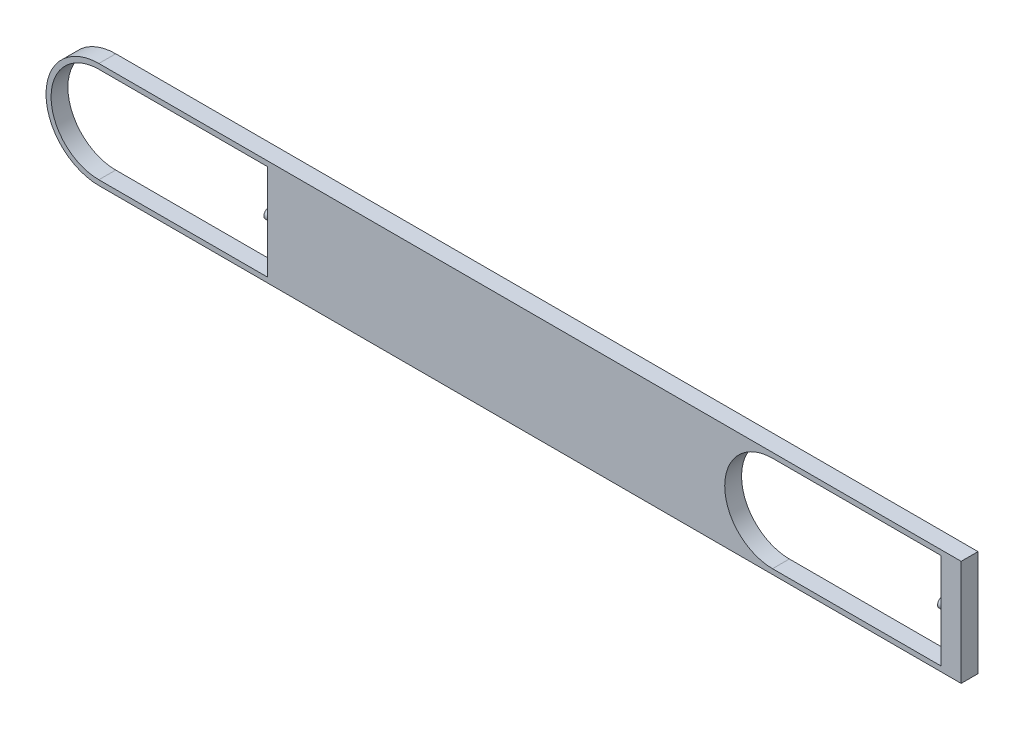
ISO-10303-21;
HEADER;
FILE_DESCRIPTION(('STEP AP214'),'2;1');
FILE_NAME('part.step','',(''),(''),'','','');
FILE_SCHEMA(('AUTOMOTIVE_DESIGN { 1 0 10303 214 1 1 1 1 }'));
ENDSEC;
DATA;
#1=APPLICATION_CONTEXT('core data for automotive mechanical design processes');
#2=APPLICATION_PROTOCOL_DEFINITION('international standard','automotive_design',2000,#1);
#3=PRODUCT_CONTEXT('',#1,'mechanical');
#4=PRODUCT('Part','Part','',(#3));
#5=PRODUCT_RELATED_PRODUCT_CATEGORY('part','',(#4));
#6=PRODUCT_DEFINITION_FORMATION('','',#4);
#7=PRODUCT_DEFINITION_CONTEXT('part definition',#1,'design');
#8=PRODUCT_DEFINITION('design','',#6,#7);
#9=PRODUCT_DEFINITION_SHAPE('','',#8);
#10=(LENGTH_UNIT() NAMED_UNIT(*) SI_UNIT(.MILLI.,.METRE.));
#11=(NAMED_UNIT(*) PLANE_ANGLE_UNIT() SI_UNIT($,.RADIAN.));
#12=(NAMED_UNIT(*) SI_UNIT($,.STERADIAN.) SOLID_ANGLE_UNIT());
#13=UNCERTAINTY_MEASURE_WITH_UNIT(LENGTH_MEASURE(1.E-05),#10,'distance_accuracy_value','');
#14=(GEOMETRIC_REPRESENTATION_CONTEXT(3) GLOBAL_UNCERTAINTY_ASSIGNED_CONTEXT((#13)) GLOBAL_UNIT_ASSIGNED_CONTEXT((#10,
#11,#12)) REPRESENTATION_CONTEXT('',''));
#15=CARTESIAN_POINT('',(0.,0.,0.));
#16=DIRECTION('',(0.,0.,1.));
#17=DIRECTION('',(1.,0.,0.));
#18=AXIS2_PLACEMENT_3D('',#15,#16,#17);
#19=CARTESIAN_POINT('',(0.,0.,6.35));
#20=DIRECTION('',(0.,0.,1.));
#21=DIRECTION('',(1.,0.,0.));
#22=AXIS2_PLACEMENT_3D('',#19,#20,#21);
#23=PLANE('',#22);
#24=DIRECTION('',(-1.,0.,0.));
#25=VECTOR('',#24,1.);
#26=CARTESIAN_POINT('',(0.,18.034,6.35));
#27=LINE('',#26,#25);
#28=CARTESIAN_POINT('',(63.5,18.034,6.35));
#29=VERTEX_POINT('',#28);
#30=CARTESIAN_POINT('',(0.,18.034,6.35));
#31=VERTEX_POINT('',#30);
#32=EDGE_CURVE('E165',#29,#31,#27,.T.);
#33=ORIENTED_EDGE('',*,*,#32,.F.);
#34=DIRECTION('',(0.,-1.,0.));
#35=VECTOR('',#34,1.);
#36=CARTESIAN_POINT('',(63.5,18.034,6.35));
#37=LINE('',#36,#35);
#38=CARTESIAN_POINT('',(63.5,-18.034,6.35));
#39=VERTEX_POINT('',#38);
#40=EDGE_CURVE('E176',#29,#39,#37,.T.);
#41=ORIENTED_EDGE('',*,*,#40,.T.);
#42=DIRECTION('',(1.,0.,0.));
#43=VECTOR('',#42,1.);
#44=CARTESIAN_POINT('',(0.,-18.034,6.35));
#45=LINE('',#44,#43);
#46=CARTESIAN_POINT('',(0.,-18.034,6.35));
#47=VERTEX_POINT('',#46);
#48=EDGE_CURVE('E163',#47,#39,#45,.T.);
#49=ORIENTED_EDGE('',*,*,#48,.F.);
#50=CARTESIAN_POINT('',(0.,0.,6.35));
#51=DIRECTION('',(0.,0.,1.));
#52=DIRECTION('',(1.,0.,0.));
#53=AXIS2_PLACEMENT_3D('',#50,#51,#52);
#54=CIRCLE('',#53,18.034);
#55=EDGE_CURVE('E152',#31,#47,#54,.T.);
#56=ORIENTED_EDGE('',*,*,#55,.F.);
#57=EDGE_LOOP('',(#33,#41,#49,#56));
#58=FACE_BOUND('',#57,.T.);
#59=DIRECTION('',(-1.,0.,0.));
#60=VECTOR('',#59,1.);
#61=CARTESIAN_POINT('',(254.,18.034,6.35));
#62=LINE('',#61,#60);
#63=CARTESIAN_POINT('',(317.5,18.034,6.35));
#64=VERTEX_POINT('',#63);
#65=CARTESIAN_POINT('',(254.,18.034,6.35));
#66=VERTEX_POINT('',#65);
#67=EDGE_CURVE('E202',#64,#66,#62,.T.);
#68=ORIENTED_EDGE('',*,*,#67,.F.);
#69=DIRECTION('',(0.,-1.,0.));
#70=VECTOR('',#69,1.);
#71=CARTESIAN_POINT('',(317.5,18.034,6.35));
#72=LINE('',#71,#70);
#73=CARTESIAN_POINT('',(317.5,-18.034,6.35));
#74=VERTEX_POINT('',#73);
#75=EDGE_CURVE('E213',#64,#74,#72,.T.);
#76=ORIENTED_EDGE('',*,*,#75,.T.);
#77=DIRECTION('',(1.,0.,0.));
#78=VECTOR('',#77,1.);
#79=CARTESIAN_POINT('',(254.,-18.034,6.35));
#80=LINE('',#79,#78);
#81=CARTESIAN_POINT('',(254.,-18.034,6.35));
#82=VERTEX_POINT('',#81);
#83=EDGE_CURVE('E199',#82,#74,#80,.T.);
#84=ORIENTED_EDGE('',*,*,#83,.F.);
#85=CARTESIAN_POINT('',(254.,0.,6.35));
#86=DIRECTION('',(0.,0.,1.));
#87=DIRECTION('',(1.,0.,0.));
#88=AXIS2_PLACEMENT_3D('',#85,#86,#87);
#89=CIRCLE('',#88,18.034);
#90=EDGE_CURVE('E188',#66,#82,#89,.T.);
#91=ORIENTED_EDGE('',*,*,#90,.F.);
#92=EDGE_LOOP('',(#68,#76,#84,#91));
#93=FACE_BOUND('',#92,.T.);
#94=DIRECTION('',(-1.,0.,0.));
#95=VECTOR('',#94,1.);
#96=CARTESIAN_POINT('',(127.,-19.939,6.34999999999999));
#97=LINE('',#96,#95);
#98=CARTESIAN_POINT('',(325.12,-19.939,6.34999999999999));
#99=VERTEX_POINT('',#98);
#100=CARTESIAN_POINT('',(0.,-19.939,6.35));
#101=VERTEX_POINT('',#100);
#102=EDGE_CURVE('E133',#99,#101,#97,.T.);
#103=ORIENTED_EDGE('',*,*,#102,.F.);
#104=DIRECTION('',(0.,-1.,0.));
#105=VECTOR('',#104,1.);
#106=CARTESIAN_POINT('',(325.12,19.939,6.35));
#107=LINE('',#106,#105);
#108=CARTESIAN_POINT('',(325.12,19.939,6.35));
#109=VERTEX_POINT('',#108);
#110=EDGE_CURVE('E120',#109,#99,#107,.T.);
#111=ORIENTED_EDGE('',*,*,#110,.F.);
#112=DIRECTION('',(-1.,0.,0.));
#113=VECTOR('',#112,1.);
#114=CARTESIAN_POINT('',(127.,19.939,6.35));
#115=LINE('',#114,#113);
#116=CARTESIAN_POINT('',(0.,19.939,6.35));
#117=VERTEX_POINT('',#116);
#118=EDGE_CURVE('E144',#109,#117,#115,.T.);
#119=ORIENTED_EDGE('',*,*,#118,.T.);
#120=CARTESIAN_POINT('',(0.,0.,6.35));
#121=DIRECTION('',(0.,0.,1.));
#122=DIRECTION('',(1.,0.,0.));
#123=AXIS2_PLACEMENT_3D('',#120,#121,#122);
#124=CIRCLE('',#123,19.939);
#125=EDGE_CURVE('E11',#117,#101,#124,.T.);
#126=ORIENTED_EDGE('',*,*,#125,.T.);
#127=EDGE_LOOP('',(#103,#111,#119,#126));
#128=FACE_BOUND('',#127,.T.);
#129=ADVANCED_FACE('F33',(#58,#93,#128),#23,.T.);
#130=CARTESIAN_POINT('',(0.,0.,0.));
#131=DIRECTION('',(0.,0.,1.));
#132=DIRECTION('',(1.,0.,0.));
#133=AXIS2_PLACEMENT_3D('',#130,#131,#132);
#134=PLANE('',#133);
#135=DIRECTION('',(0.,-1.,0.));
#136=VECTOR('',#135,1.);
#137=CARTESIAN_POINT('',(317.5,18.034,0.));
#138=LINE('',#137,#136);
#139=CARTESIAN_POINT('',(317.5,18.034,0.));
#140=VERTEX_POINT('',#139);
#141=CARTESIAN_POINT('',(317.5,-18.034,0.));
#142=VERTEX_POINT('',#141);
#143=EDGE_CURVE('E211',#140,#142,#138,.T.);
#144=ORIENTED_EDGE('',*,*,#143,.F.);
#145=DIRECTION('',(-1.,0.,0.));
#146=VECTOR('',#145,1.);
#147=CARTESIAN_POINT('',(254.,18.034,0.));
#148=LINE('',#147,#146);
#149=CARTESIAN_POINT('',(254.,18.034,0.));
#150=VERTEX_POINT('',#149);
#151=EDGE_CURVE('E201',#140,#150,#148,.T.);
#152=ORIENTED_EDGE('',*,*,#151,.T.);
#153=CARTESIAN_POINT('',(254.,0.,0.));
#154=DIRECTION('',(0.,0.,1.));
#155=DIRECTION('',(1.,0.,0.));
#156=AXIS2_PLACEMENT_3D('',#153,#154,#155);
#157=CIRCLE('',#156,18.034);
#158=CARTESIAN_POINT('',(254.,-18.034,0.));
#159=VERTEX_POINT('',#158);
#160=EDGE_CURVE('E185',#150,#159,#157,.T.);
#161=ORIENTED_EDGE('',*,*,#160,.T.);
#162=DIRECTION('',(1.,0.,0.));
#163=VECTOR('',#162,1.);
#164=CARTESIAN_POINT('',(254.,-18.034,0.));
#165=LINE('',#164,#163);
#166=EDGE_CURVE('E197',#159,#142,#165,.T.);
#167=ORIENTED_EDGE('',*,*,#166,.T.);
#168=EDGE_LOOP('',(#144,#152,#161,#167));
#169=FACE_BOUND('',#168,.T.);
#170=DIRECTION('',(0.,-1.,0.));
#171=VECTOR('',#170,1.);
#172=CARTESIAN_POINT('',(63.5,18.034,0.));
#173=LINE('',#172,#171);
#174=CARTESIAN_POINT('',(63.5,18.034,0.));
#175=VERTEX_POINT('',#174);
#176=CARTESIAN_POINT('',(63.5,-18.034,0.));
#177=VERTEX_POINT('',#176);
#178=EDGE_CURVE('E174',#175,#177,#173,.T.);
#179=ORIENTED_EDGE('',*,*,#178,.F.);
#180=DIRECTION('',(-1.,0.,0.));
#181=VECTOR('',#180,1.);
#182=CARTESIAN_POINT('',(0.,18.034,0.));
#183=LINE('',#182,#181);
#184=CARTESIAN_POINT('',(0.,18.034,0.));
#185=VERTEX_POINT('',#184);
#186=EDGE_CURVE('E56',#175,#185,#183,.T.);
#187=ORIENTED_EDGE('',*,*,#186,.T.);
#188=CARTESIAN_POINT('',(0.,0.,0.));
#189=DIRECTION('',(0.,0.,1.));
#190=DIRECTION('',(1.,0.,0.));
#191=AXIS2_PLACEMENT_3D('',#188,#189,#190);
#192=CIRCLE('',#191,18.034);
#193=CARTESIAN_POINT('',(0.,-18.034,0.));
#194=VERTEX_POINT('',#193);
#195=EDGE_CURVE('E151',#185,#194,#192,.T.);
#196=ORIENTED_EDGE('',*,*,#195,.T.);
#197=DIRECTION('',(1.,0.,0.));
#198=VECTOR('',#197,1.);
#199=CARTESIAN_POINT('',(0.,-18.034,0.));
#200=LINE('',#199,#198);
#201=EDGE_CURVE('E161',#194,#177,#200,.T.);
#202=ORIENTED_EDGE('',*,*,#201,.T.);
#203=EDGE_LOOP('',(#179,#187,#196,#202));
#204=FACE_BOUND('',#203,.T.);
#205=DIRECTION('',(0.,1.,0.));
#206=VECTOR('',#205,1.);
#207=CARTESIAN_POINT('',(325.12,19.939,0.));
#208=LINE('',#207,#206);
#209=CARTESIAN_POINT('',(325.12,-19.939,0.));
#210=VERTEX_POINT('',#209);
#211=CARTESIAN_POINT('',(325.12,19.939,0.));
#212=VERTEX_POINT('',#211);
#213=EDGE_CURVE('E48',#210,#212,#208,.T.);
#214=ORIENTED_EDGE('',*,*,#213,.F.);
#215=DIRECTION('',(-1.,0.,0.));
#216=VECTOR('',#215,1.);
#217=CARTESIAN_POINT('',(127.,-19.939,0.));
#218=LINE('',#217,#216);
#219=CARTESIAN_POINT('',(0.,-19.939,0.));
#220=VERTEX_POINT('',#219);
#221=EDGE_CURVE('E135',#210,#220,#218,.T.);
#222=ORIENTED_EDGE('',*,*,#221,.T.);
#223=CARTESIAN_POINT('',(0.,0.,0.));
#224=DIRECTION('',(0.,0.,1.));
#225=DIRECTION('',(1.,0.,0.));
#226=AXIS2_PLACEMENT_3D('',#223,#224,#225);
#227=CIRCLE('',#226,19.939);
#228=CARTESIAN_POINT('',(0.,19.939,0.));
#229=VERTEX_POINT('',#228);
#230=EDGE_CURVE('E37',#229,#220,#227,.T.);
#231=ORIENTED_EDGE('',*,*,#230,.F.);
#232=DIRECTION('',(-1.,0.,0.));
#233=VECTOR('',#232,1.);
#234=CARTESIAN_POINT('',(127.,19.939,0.));
#235=LINE('',#234,#233);
#236=EDGE_CURVE('E140',#212,#229,#235,.T.);
#237=ORIENTED_EDGE('',*,*,#236,.F.);
#238=EDGE_LOOP('',(#214,#222,#231,#237));
#239=FACE_BOUND('',#238,.T.);
#240=ADVANCED_FACE('F255',(#169,#204,#239),#134,.F.);
#241=CARTESIAN_POINT('',(127.,-19.939,6.34999999999999));
#242=DIRECTION('',(0.,1.,0.));
#243=DIRECTION('',(0.,0.,1.));
#244=AXIS2_PLACEMENT_3D('',#241,#242,#243);
#245=PLANE('',#244);
#246=DIRECTION('',(0.,0.,-1.));
#247=VECTOR('',#246,1.);
#248=CARTESIAN_POINT('',(325.12,-19.939,6.34999999999999));
#249=LINE('',#248,#247);
#250=EDGE_CURVE('E123',#99,#210,#249,.T.);
#251=ORIENTED_EDGE('',*,*,#250,.F.);
#252=ORIENTED_EDGE('',*,*,#102,.T.);
#253=DIRECTION('',(0.,0.,-1.));
#254=VECTOR('',#253,1.);
#255=CARTESIAN_POINT('',(0.,-19.939,6.34999999999999));
#256=LINE('',#255,#254);
#257=EDGE_CURVE('E149',#101,#220,#256,.T.);
#258=ORIENTED_EDGE('',*,*,#257,.T.);
#259=ORIENTED_EDGE('',*,*,#221,.F.);
#260=EDGE_LOOP('',(#251,#252,#258,#259));
#261=FACE_BOUND('',#260,.T.);
#262=ADVANCED_FACE('F131',(#261),#245,.F.);
#263=CARTESIAN_POINT('',(127.,19.939,6.35));
#264=DIRECTION('',(0.,-1.,0.));
#265=DIRECTION('',(0.,0.,-1.));
#266=AXIS2_PLACEMENT_3D('',#263,#264,#265);
#267=PLANE('',#266);
#268=DIRECTION('',(0.,0.,1.));
#269=VECTOR('',#268,1.);
#270=CARTESIAN_POINT('',(325.12,19.939,6.35));
#271=LINE('',#270,#269);
#272=EDGE_CURVE('E124',#212,#109,#271,.T.);
#273=ORIENTED_EDGE('',*,*,#272,.F.);
#274=ORIENTED_EDGE('',*,*,#236,.T.);
#275=DIRECTION('',(0.,0.,1.));
#276=VECTOR('',#275,1.);
#277=CARTESIAN_POINT('',(0.,19.939,6.35));
#278=LINE('',#277,#276);
#279=EDGE_CURVE('E146',#229,#117,#278,.T.);
#280=ORIENTED_EDGE('',*,*,#279,.T.);
#281=ORIENTED_EDGE('',*,*,#118,.F.);
#282=EDGE_LOOP('',(#273,#274,#280,#281));
#283=FACE_BOUND('',#282,.T.);
#284=ADVANCED_FACE('F274',(#283),#267,.F.);
#285=CARTESIAN_POINT('',(0.,0.,6.35));
#286=DIRECTION('',(0.,0.,-1.));
#287=DIRECTION('',(-1.,0.,0.));
#288=AXIS2_PLACEMENT_3D('',#285,#286,#287);
#289=CYLINDRICAL_SURFACE('',#288,19.939);
#290=ORIENTED_EDGE('',*,*,#257,.F.);
#291=ORIENTED_EDGE('',*,*,#125,.F.);
#292=ORIENTED_EDGE('',*,*,#279,.F.);
#293=ORIENTED_EDGE('',*,*,#230,.T.);
#294=EDGE_LOOP('',(#290,#291,#292,#293));
#295=FACE_BOUND('',#294,.T.);
#296=ADVANCED_FACE('F35',(#295),#289,.T.);
#297=CARTESIAN_POINT('',(0.,0.,0.));
#298=DIRECTION('',(0.,0.,1.));
#299=DIRECTION('',(1.,0.,0.));
#300=AXIS2_PLACEMENT_3D('',#297,#298,#299);
#301=CYLINDRICAL_SURFACE('',#300,18.034);
#302=ORIENTED_EDGE('',*,*,#55,.T.);
#303=DIRECTION('',(0.,0.,1.));
#304=VECTOR('',#303,1.);
#305=CARTESIAN_POINT('',(0.,-18.034,0.));
#306=LINE('',#305,#304);
#307=EDGE_CURVE('E155',#194,#47,#306,.T.);
#308=ORIENTED_EDGE('',*,*,#307,.F.);
#309=ORIENTED_EDGE('',*,*,#195,.F.);
#310=DIRECTION('',(0.,0.,1.));
#311=VECTOR('',#310,1.);
#312=CARTESIAN_POINT('',(0.,18.034,0.));
#313=LINE('',#312,#311);
#314=EDGE_CURVE('E158',#185,#31,#313,.T.);
#315=ORIENTED_EDGE('',*,*,#314,.T.);
#316=EDGE_LOOP('',(#302,#308,#309,#315));
#317=FACE_BOUND('',#316,.T.);
#318=ADVANCED_FACE('F278',(#317),#301,.F.);
#319=CARTESIAN_POINT('',(0.,18.034,0.));
#320=DIRECTION('',(0.,1.,0.));
#321=DIRECTION('',(0.,0.,1.));
#322=AXIS2_PLACEMENT_3D('',#319,#320,#321);
#323=PLANE('',#322);
#324=ORIENTED_EDGE('',*,*,#186,.F.);
#325=DIRECTION('',(0.,0.,1.));
#326=VECTOR('',#325,1.);
#327=CARTESIAN_POINT('',(63.5,18.034,0.));
#328=LINE('',#327,#326);
#329=EDGE_CURVE('E167',#175,#29,#328,.T.);
#330=ORIENTED_EDGE('',*,*,#329,.T.);
#331=ORIENTED_EDGE('',*,*,#32,.T.);
#332=ORIENTED_EDGE('',*,*,#314,.F.);
#333=EDGE_LOOP('',(#324,#330,#331,#332));
#334=FACE_BOUND('',#333,.T.);
#335=ADVANCED_FACE('F281',(#334),#323,.F.);
#336=CARTESIAN_POINT('',(0.,-18.034,0.));
#337=DIRECTION('',(0.,-1.,0.));
#338=DIRECTION('',(0.,0.,-1.));
#339=AXIS2_PLACEMENT_3D('',#336,#337,#338);
#340=PLANE('',#339);
#341=ORIENTED_EDGE('',*,*,#48,.T.);
#342=DIRECTION('',(0.,0.,1.));
#343=VECTOR('',#342,1.);
#344=CARTESIAN_POINT('',(63.5,-18.034,0.));
#345=LINE('',#344,#343);
#346=EDGE_CURVE('E171',#177,#39,#345,.T.);
#347=ORIENTED_EDGE('',*,*,#346,.F.);
#348=ORIENTED_EDGE('',*,*,#201,.F.);
#349=ORIENTED_EDGE('',*,*,#307,.T.);
#350=EDGE_LOOP('',(#341,#347,#348,#349));
#351=FACE_BOUND('',#350,.T.);
#352=ADVANCED_FACE('F285',(#351),#340,.F.);
#353=CARTESIAN_POINT('',(63.5,18.034,0.));
#354=DIRECTION('',(-1.,0.,0.));
#355=DIRECTION('',(0.,0.,1.));
#356=AXIS2_PLACEMENT_3D('',#353,#354,#355);
#357=PLANE('',#356);
#358=CARTESIAN_POINT('',(63.5,0.,3.175));
#359=DIRECTION('',(-1.,0.,0.));
#360=DIRECTION('',(0.,0.,1.));
#361=AXIS2_PLACEMENT_3D('',#358,#359,#360);
#362=CIRCLE('',#361,1.905);
#363=CARTESIAN_POINT('',(63.5,0.,5.08));
#364=VERTEX_POINT('',#363);
#365=EDGE_CURVE('E182',#364,#364,#362,.T.);
#366=ORIENTED_EDGE('',*,*,#365,.F.);
#367=EDGE_LOOP('',(#366));
#368=FACE_BOUND('',#367,.T.);
#369=ORIENTED_EDGE('',*,*,#40,.F.);
#370=ORIENTED_EDGE('',*,*,#329,.F.);
#371=ORIENTED_EDGE('',*,*,#178,.T.);
#372=ORIENTED_EDGE('',*,*,#346,.T.);
#373=EDGE_LOOP('',(#369,#370,#371,#372));
#374=FACE_BOUND('',#373,.T.);
#375=ADVANCED_FACE('F288',(#368,#374),#357,.T.);
#376=CARTESIAN_POINT('',(60.96,0.,3.175));
#377=DIRECTION('',(1.,0.,0.));
#378=DIRECTION('',(0.,0.,-1.));
#379=AXIS2_PLACEMENT_3D('',#376,#377,#378);
#380=CYLINDRICAL_SURFACE('',#379,1.905);
#381=CARTESIAN_POINT('',(60.96,0.,3.175));
#382=DIRECTION('',(-1.,0.,0.));
#383=DIRECTION('',(0.,0.,1.));
#384=AXIS2_PLACEMENT_3D('',#381,#382,#383);
#385=CIRCLE('',#384,1.905);
#386=CARTESIAN_POINT('',(60.96,0.,5.08));
#387=VERTEX_POINT('',#386);
#388=EDGE_CURVE('E179',#387,#387,#385,.T.);
#389=ORIENTED_EDGE('',*,*,#388,.F.);
#390=EDGE_LOOP('',(#389));
#391=FACE_BOUND('',#390,.T.);
#392=ORIENTED_EDGE('',*,*,#365,.T.);
#393=EDGE_LOOP('',(#392));
#394=FACE_BOUND('',#393,.T.);
#395=ADVANCED_FACE('F292',(#391,#394),#380,.T.);
#396=CARTESIAN_POINT('',(60.96,0.,3.175));
#397=DIRECTION('',(-1.,0.,0.));
#398=DIRECTION('',(0.,0.,1.));
#399=AXIS2_PLACEMENT_3D('',#396,#397,#398);
#400=PLANE('',#399);
#401=ORIENTED_EDGE('',*,*,#388,.T.);
#402=EDGE_LOOP('',(#401));
#403=FACE_BOUND('',#402,.T.);
#404=ADVANCED_FACE('F296',(#403),#400,.T.);
#405=CARTESIAN_POINT('',(254.,0.,0.));
#406=DIRECTION('',(0.,0.,1.));
#407=DIRECTION('',(1.,0.,0.));
#408=AXIS2_PLACEMENT_3D('',#405,#406,#407);
#409=CYLINDRICAL_SURFACE('',#408,18.034);
#410=ORIENTED_EDGE('',*,*,#90,.T.);
#411=DIRECTION('',(0.,0.,1.));
#412=VECTOR('',#411,1.);
#413=CARTESIAN_POINT('',(254.,-18.034,0.));
#414=LINE('',#413,#412);
#415=EDGE_CURVE('E191',#159,#82,#414,.T.);
#416=ORIENTED_EDGE('',*,*,#415,.F.);
#417=ORIENTED_EDGE('',*,*,#160,.F.);
#418=DIRECTION('',(0.,0.,1.));
#419=VECTOR('',#418,1.);
#420=CARTESIAN_POINT('',(254.,18.034,0.));
#421=LINE('',#420,#419);
#422=EDGE_CURVE('E194',#150,#66,#421,.T.);
#423=ORIENTED_EDGE('',*,*,#422,.T.);
#424=EDGE_LOOP('',(#410,#416,#417,#423));
#425=FACE_BOUND('',#424,.T.);
#426=ADVANCED_FACE('F252',(#425),#409,.F.);
#427=CARTESIAN_POINT('',(254.,18.034,0.));
#428=DIRECTION('',(0.,1.,0.));
#429=DIRECTION('',(0.,0.,1.));
#430=AXIS2_PLACEMENT_3D('',#427,#428,#429);
#431=PLANE('',#430);
#432=ORIENTED_EDGE('',*,*,#151,.F.);
#433=DIRECTION('',(0.,0.,1.));
#434=VECTOR('',#433,1.);
#435=CARTESIAN_POINT('',(317.5,18.034,0.));
#436=LINE('',#435,#434);
#437=EDGE_CURVE('E204',#140,#64,#436,.T.);
#438=ORIENTED_EDGE('',*,*,#437,.T.);
#439=ORIENTED_EDGE('',*,*,#67,.T.);
#440=ORIENTED_EDGE('',*,*,#422,.F.);
#441=EDGE_LOOP('',(#432,#438,#439,#440));
#442=FACE_BOUND('',#441,.T.);
#443=ADVANCED_FACE('F249',(#442),#431,.F.);
#444=CARTESIAN_POINT('',(254.,-18.034,0.));
#445=DIRECTION('',(0.,-1.,0.));
#446=DIRECTION('',(0.,0.,-1.));
#447=AXIS2_PLACEMENT_3D('',#444,#445,#446);
#448=PLANE('',#447);
#449=ORIENTED_EDGE('',*,*,#83,.T.);
#450=DIRECTION('',(0.,0.,1.));
#451=VECTOR('',#450,1.);
#452=CARTESIAN_POINT('',(317.5,-18.034,0.));
#453=LINE('',#452,#451);
#454=EDGE_CURVE('E208',#142,#74,#453,.T.);
#455=ORIENTED_EDGE('',*,*,#454,.F.);
#456=ORIENTED_EDGE('',*,*,#166,.F.);
#457=ORIENTED_EDGE('',*,*,#415,.T.);
#458=EDGE_LOOP('',(#449,#455,#456,#457));
#459=FACE_BOUND('',#458,.T.);
#460=ADVANCED_FACE('F238',(#459),#448,.F.);
#461=CARTESIAN_POINT('',(317.5,18.034,0.));
#462=DIRECTION('',(-1.,0.,0.));
#463=DIRECTION('',(0.,0.,1.));
#464=AXIS2_PLACEMENT_3D('',#461,#462,#463);
#465=PLANE('',#464);
#466=CARTESIAN_POINT('',(317.5,0.,3.175));
#467=DIRECTION('',(-1.,0.,0.));
#468=DIRECTION('',(0.,0.,1.));
#469=AXIS2_PLACEMENT_3D('',#466,#467,#468);
#470=CIRCLE('',#469,1.905);
#471=CARTESIAN_POINT('',(317.5,0.,5.08));
#472=VERTEX_POINT('',#471);
#473=EDGE_CURVE('E219',#472,#472,#470,.T.);
#474=ORIENTED_EDGE('',*,*,#473,.F.);
#475=EDGE_LOOP('',(#474));
#476=FACE_BOUND('',#475,.T.);
#477=ORIENTED_EDGE('',*,*,#75,.F.);
#478=ORIENTED_EDGE('',*,*,#437,.F.);
#479=ORIENTED_EDGE('',*,*,#143,.T.);
#480=ORIENTED_EDGE('',*,*,#454,.T.);
#481=EDGE_LOOP('',(#477,#478,#479,#480));
#482=FACE_BOUND('',#481,.T.);
#483=ADVANCED_FACE('F232',(#476,#482),#465,.T.);
#484=CARTESIAN_POINT('',(314.96,0.,3.175));
#485=DIRECTION('',(1.,0.,0.));
#486=DIRECTION('',(0.,0.,-1.));
#487=AXIS2_PLACEMENT_3D('',#484,#485,#486);
#488=CYLINDRICAL_SURFACE('',#487,1.905);
#489=CARTESIAN_POINT('',(314.96,0.,3.175));
#490=DIRECTION('',(-1.,0.,0.));
#491=DIRECTION('',(0.,0.,1.));
#492=AXIS2_PLACEMENT_3D('',#489,#490,#491);
#493=CIRCLE('',#492,1.905);
#494=CARTESIAN_POINT('',(314.96,0.,5.08));
#495=VERTEX_POINT('',#494);
#496=EDGE_CURVE('E216',#495,#495,#493,.T.);
#497=ORIENTED_EDGE('',*,*,#496,.F.);
#498=EDGE_LOOP('',(#497));
#499=FACE_BOUND('',#498,.T.);
#500=ORIENTED_EDGE('',*,*,#473,.T.);
#501=EDGE_LOOP('',(#500));
#502=FACE_BOUND('',#501,.T.);
#503=ADVANCED_FACE('F229',(#499,#502),#488,.T.);
#504=CARTESIAN_POINT('',(314.96,0.,3.175));
#505=DIRECTION('',(-1.,0.,0.));
#506=DIRECTION('',(0.,0.,1.));
#507=AXIS2_PLACEMENT_3D('',#504,#505,#506);
#508=PLANE('',#507);
#509=ORIENTED_EDGE('',*,*,#496,.T.);
#510=EDGE_LOOP('',(#509));
#511=FACE_BOUND('',#510,.T.);
#512=ADVANCED_FACE('F227',(#511),#508,.T.);
#513=CARTESIAN_POINT('',(325.12,0.,0.));
#514=DIRECTION('',(1.,0.,0.));
#515=DIRECTION('',(0.,0.,-1.));
#516=AXIS2_PLACEMENT_3D('',#513,#514,#515);
#517=PLANE('',#516);
#518=ORIENTED_EDGE('',*,*,#110,.T.);
#519=ORIENTED_EDGE('',*,*,#250,.T.);
#520=ORIENTED_EDGE('',*,*,#213,.T.);
#521=ORIENTED_EDGE('',*,*,#272,.T.);
#522=EDGE_LOOP('',(#518,#519,#520,#521));
#523=FACE_BOUND('',#522,.T.);
#524=ADVANCED_FACE('F122',(#523),#517,.T.);
#525=CLOSED_SHELL('',(#129,#240,#262,#284,#296,#318,#335,#352,#375,#395,#404,#426,#443,#460,
#483,#503,#512,#524));
#526=MANIFOLD_SOLID_BREP('B2',#525);
#527=ADVANCED_BREP_SHAPE_REPRESENTATION('',(#18,#526),#14);
#528=SHAPE_DEFINITION_REPRESENTATION(#9,#527);
ENDSEC;
END-ISO-10303-21;
